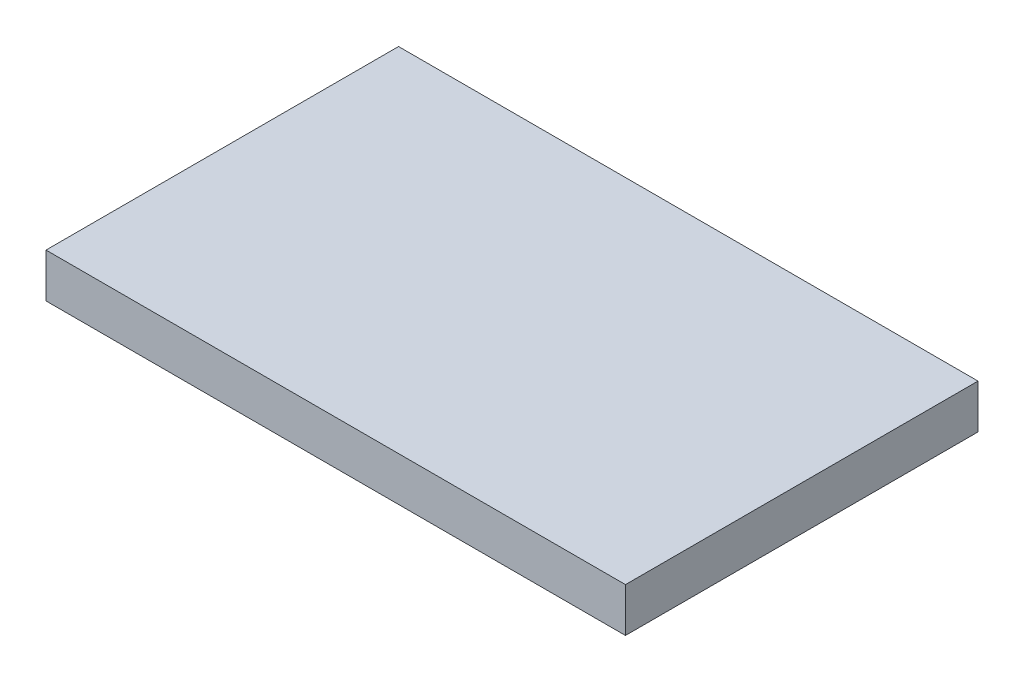
ISO-10303-21;
HEADER;
FILE_DESCRIPTION(('STEP AP214'),'2;1');
FILE_NAME('part.step','',(''),(''),'','','');
FILE_SCHEMA(('AUTOMOTIVE_DESIGN { 1 0 10303 214 1 1 1 1 }'));
ENDSEC;
DATA;
#1=APPLICATION_CONTEXT('core data for automotive mechanical design processes');
#2=APPLICATION_PROTOCOL_DEFINITION('international standard','automotive_design',2000,#1);
#3=PRODUCT_CONTEXT('',#1,'mechanical');
#4=PRODUCT('Part','Part','',(#3));
#5=PRODUCT_RELATED_PRODUCT_CATEGORY('part','',(#4));
#6=PRODUCT_DEFINITION_FORMATION('','',#4);
#7=PRODUCT_DEFINITION_CONTEXT('part definition',#1,'design');
#8=PRODUCT_DEFINITION('design','',#6,#7);
#9=PRODUCT_DEFINITION_SHAPE('','',#8);
#10=(LENGTH_UNIT() NAMED_UNIT(*) SI_UNIT(.MILLI.,.METRE.));
#11=(NAMED_UNIT(*) PLANE_ANGLE_UNIT() SI_UNIT($,.RADIAN.));
#12=(NAMED_UNIT(*) SI_UNIT($,.STERADIAN.) SOLID_ANGLE_UNIT());
#13=UNCERTAINTY_MEASURE_WITH_UNIT(LENGTH_MEASURE(1.E-05),#10,'distance_accuracy_value','');
#14=(GEOMETRIC_REPRESENTATION_CONTEXT(3) GLOBAL_UNCERTAINTY_ASSIGNED_CONTEXT((#13)) GLOBAL_UNIT_ASSIGNED_CONTEXT((#10,
#11,#12)) REPRESENTATION_CONTEXT('',''));
#15=CARTESIAN_POINT('',(0.,0.,0.));
#16=DIRECTION('',(0.,0.,1.));
#17=DIRECTION('',(1.,0.,0.));
#18=AXIS2_PLACEMENT_3D('',#15,#16,#17);
#19=CARTESIAN_POINT('',(83.5,6.35,0.));
#20=DIRECTION('',(-1.,0.,0.));
#21=DIRECTION('',(0.,0.,1.));
#22=AXIS2_PLACEMENT_3D('',#19,#20,#21);
#23=PLANE('',#22);
#24=DIRECTION('',(0.,0.,-1.));
#25=VECTOR('',#24,1.);
#26=CARTESIAN_POINT('',(83.5,0.,0.));
#27=LINE('',#26,#25);
#28=CARTESIAN_POINT('',(83.5,0.,0.));
#29=VERTEX_POINT('',#28);
#30=CARTESIAN_POINT('',(83.5,0.,-50.8));
#31=VERTEX_POINT('',#30);
#32=EDGE_CURVE('E107',#29,#31,#27,.T.);
#33=ORIENTED_EDGE('',*,*,#32,.T.);
#34=DIRECTION('',(0.,-1.,0.));
#35=VECTOR('',#34,1.);
#36=CARTESIAN_POINT('',(83.5,6.35,-50.8));
#37=LINE('',#36,#35);
#38=CARTESIAN_POINT('',(83.5,6.35,-50.8));
#39=VERTEX_POINT('',#38);
#40=EDGE_CURVE('E11',#39,#31,#37,.T.);
#41=ORIENTED_EDGE('',*,*,#40,.F.);
#42=DIRECTION('',(0.,0.,-1.));
#43=VECTOR('',#42,1.);
#44=CARTESIAN_POINT('',(83.5,6.35,0.));
#45=LINE('',#44,#43);
#46=CARTESIAN_POINT('',(83.5,6.35,0.));
#47=VERTEX_POINT('',#46);
#48=EDGE_CURVE('E91',#47,#39,#45,.T.);
#49=ORIENTED_EDGE('',*,*,#48,.F.);
#50=DIRECTION('',(0.,-1.,0.));
#51=VECTOR('',#50,1.);
#52=CARTESIAN_POINT('',(83.5,6.35,0.));
#53=LINE('',#52,#51);
#54=EDGE_CURVE('E103',#47,#29,#53,.T.);
#55=ORIENTED_EDGE('',*,*,#54,.T.);
#56=EDGE_LOOP('',(#33,#41,#49,#55));
#57=FACE_BOUND('',#56,.T.);
#58=ADVANCED_FACE('F39',(#57),#23,.F.);
#59=CARTESIAN_POINT('',(83.5,6.35,-50.8));
#60=DIRECTION('',(0.,0.,1.));
#61=DIRECTION('',(1.,0.,0.));
#62=AXIS2_PLACEMENT_3D('',#59,#60,#61);
#63=PLANE('',#62);
#64=DIRECTION('',(-1.,0.,0.));
#65=VECTOR('',#64,1.);
#66=CARTESIAN_POINT('',(83.5,0.,-50.8));
#67=LINE('',#66,#65);
#68=CARTESIAN_POINT('',(0.,0.,-50.8));
#69=VERTEX_POINT('',#68);
#70=EDGE_CURVE('E96',#31,#69,#67,.T.);
#71=ORIENTED_EDGE('',*,*,#70,.T.);
#72=DIRECTION('',(0.,-1.,0.));
#73=VECTOR('',#72,1.);
#74=CARTESIAN_POINT('',(0.,6.35,-50.8));
#75=LINE('',#74,#73);
#76=CARTESIAN_POINT('',(0.,6.35,-50.8));
#77=VERTEX_POINT('',#76);
#78=EDGE_CURVE('E48',#77,#69,#75,.T.);
#79=ORIENTED_EDGE('',*,*,#78,.F.);
#80=DIRECTION('',(-1.,0.,0.));
#81=VECTOR('',#80,1.);
#82=CARTESIAN_POINT('',(83.5,6.35,-50.8));
#83=LINE('',#82,#81);
#84=EDGE_CURVE('E86',#39,#77,#83,.T.);
#85=ORIENTED_EDGE('',*,*,#84,.F.);
#86=ORIENTED_EDGE('',*,*,#40,.T.);
#87=EDGE_LOOP('',(#71,#79,#85,#86));
#88=FACE_BOUND('',#87,.T.);
#89=ADVANCED_FACE('F95',(#88),#63,.F.);
#90=CARTESIAN_POINT('',(0.,6.35,-50.8));
#91=DIRECTION('',(1.,0.,0.));
#92=DIRECTION('',(0.,0.,-1.));
#93=AXIS2_PLACEMENT_3D('',#90,#91,#92);
#94=PLANE('',#93);
#95=DIRECTION('',(0.,0.,1.));
#96=VECTOR('',#95,1.);
#97=CARTESIAN_POINT('',(0.,0.,-50.8));
#98=LINE('',#97,#96);
#99=CARTESIAN_POINT('',(0.,0.,0.));
#100=VERTEX_POINT('',#99);
#101=EDGE_CURVE('E73',#69,#100,#98,.T.);
#102=ORIENTED_EDGE('',*,*,#101,.T.);
#103=DIRECTION('',(0.,-1.,0.));
#104=VECTOR('',#103,1.);
#105=CARTESIAN_POINT('',(0.,6.35,0.));
#106=LINE('',#105,#104);
#107=CARTESIAN_POINT('',(0.,6.35,0.));
#108=VERTEX_POINT('',#107);
#109=EDGE_CURVE('E98',#108,#100,#106,.T.);
#110=ORIENTED_EDGE('',*,*,#109,.F.);
#111=DIRECTION('',(0.,0.,1.));
#112=VECTOR('',#111,1.);
#113=CARTESIAN_POINT('',(0.,6.35,-50.8));
#114=LINE('',#113,#112);
#115=EDGE_CURVE('E89',#77,#108,#114,.T.);
#116=ORIENTED_EDGE('',*,*,#115,.F.);
#117=ORIENTED_EDGE('',*,*,#78,.T.);
#118=EDGE_LOOP('',(#102,#110,#116,#117));
#119=FACE_BOUND('',#118,.T.);
#120=ADVANCED_FACE('F99',(#119),#94,.F.);
#121=CARTESIAN_POINT('',(0.,6.35,0.));
#122=DIRECTION('',(0.,0.,-1.));
#123=DIRECTION('',(-1.,0.,0.));
#124=AXIS2_PLACEMENT_3D('',#121,#122,#123);
#125=PLANE('',#124);
#126=DIRECTION('',(1.,0.,0.));
#127=VECTOR('',#126,1.);
#128=CARTESIAN_POINT('',(0.,0.,0.));
#129=LINE('',#128,#127);
#130=EDGE_CURVE('E79',#100,#29,#129,.T.);
#131=ORIENTED_EDGE('',*,*,#130,.T.);
#132=ORIENTED_EDGE('',*,*,#54,.F.);
#133=DIRECTION('',(1.,0.,0.));
#134=VECTOR('',#133,1.);
#135=CARTESIAN_POINT('',(0.,6.35,0.));
#136=LINE('',#135,#134);
#137=EDGE_CURVE('E56',#108,#47,#136,.T.);
#138=ORIENTED_EDGE('',*,*,#137,.F.);
#139=ORIENTED_EDGE('',*,*,#109,.T.);
#140=EDGE_LOOP('',(#131,#132,#138,#139));
#141=FACE_BOUND('',#140,.T.);
#142=ADVANCED_FACE('F120',(#141),#125,.F.);
#143=CARTESIAN_POINT('',(0.,6.35,0.));
#144=DIRECTION('',(0.,1.,0.));
#145=DIRECTION('',(0.,0.,1.));
#146=AXIS2_PLACEMENT_3D('',#143,#144,#145);
#147=PLANE('',#146);
#148=ORIENTED_EDGE('',*,*,#48,.T.);
#149=ORIENTED_EDGE('',*,*,#84,.T.);
#150=ORIENTED_EDGE('',*,*,#115,.T.);
#151=ORIENTED_EDGE('',*,*,#137,.T.);
#152=EDGE_LOOP('',(#148,#149,#150,#151));
#153=FACE_BOUND('',#152,.T.);
#154=ADVANCED_FACE('F87',(#153),#147,.T.);
#155=CARTESIAN_POINT('',(0.,0.,0.));
#156=DIRECTION('',(0.,1.,0.));
#157=DIRECTION('',(0.,0.,1.));
#158=AXIS2_PLACEMENT_3D('',#155,#156,#157);
#159=PLANE('',#158);
#160=ORIENTED_EDGE('',*,*,#32,.F.);
#161=ORIENTED_EDGE('',*,*,#130,.F.);
#162=ORIENTED_EDGE('',*,*,#101,.F.);
#163=ORIENTED_EDGE('',*,*,#70,.F.);
#164=EDGE_LOOP('',(#160,#161,#162,#163));
#165=FACE_BOUND('',#164,.T.);
#166=ADVANCED_FACE('F123',(#165),#159,.F.);
#167=CLOSED_SHELL('',(#58,#89,#120,#142,#154,#166));
#168=MANIFOLD_SOLID_BREP('B2',#167);
#169=ADVANCED_BREP_SHAPE_REPRESENTATION('',(#18,#168),#14);
#170=SHAPE_DEFINITION_REPRESENTATION(#9,#169);
ENDSEC;
END-ISO-10303-21;
